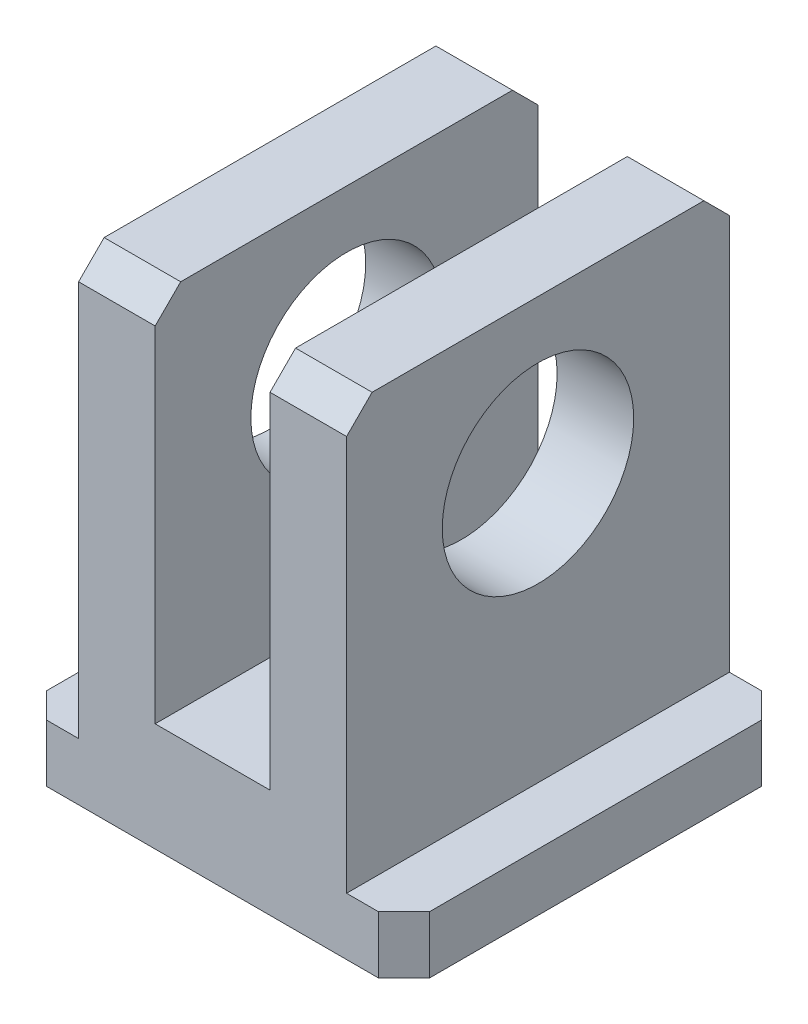
ISO-10303-21;
HEADER;
FILE_DESCRIPTION(('STEP AP214'),'2;1');
FILE_NAME('part.step','',(''),(''),'','','');
FILE_SCHEMA(('AUTOMOTIVE_DESIGN { 1 0 10303 214 1 1 1 1 }'));
ENDSEC;
DATA;
#1=APPLICATION_CONTEXT('core data for automotive mechanical design processes');
#2=APPLICATION_PROTOCOL_DEFINITION('international standard','automotive_design',2000,#1);
#3=PRODUCT_CONTEXT('',#1,'mechanical');
#4=PRODUCT('Part','Part','',(#3));
#5=PRODUCT_RELATED_PRODUCT_CATEGORY('part','',(#4));
#6=PRODUCT_DEFINITION_FORMATION('','',#4);
#7=PRODUCT_DEFINITION_CONTEXT('part definition',#1,'design');
#8=PRODUCT_DEFINITION('design','',#6,#7);
#9=PRODUCT_DEFINITION_SHAPE('','',#8);
#10=(LENGTH_UNIT() NAMED_UNIT(*) SI_UNIT(.MILLI.,.METRE.));
#11=(NAMED_UNIT(*) PLANE_ANGLE_UNIT() SI_UNIT($,.RADIAN.));
#12=(NAMED_UNIT(*) SI_UNIT($,.STERADIAN.) SOLID_ANGLE_UNIT());
#13=UNCERTAINTY_MEASURE_WITH_UNIT(LENGTH_MEASURE(1.E-05),#10,'distance_accuracy_value','');
#14=(GEOMETRIC_REPRESENTATION_CONTEXT(3) GLOBAL_UNCERTAINTY_ASSIGNED_CONTEXT((#13)) GLOBAL_UNIT_ASSIGNED_CONTEXT((#10,
#11,#12)) REPRESENTATION_CONTEXT('',''));
#15=CARTESIAN_POINT('',(0.,0.,0.));
#16=DIRECTION('',(0.,0.,1.));
#17=DIRECTION('',(1.,0.,0.));
#18=AXIS2_PLACEMENT_3D('',#15,#16,#17);
#19=CARTESIAN_POINT('',(0.,37.5,0.));
#20=DIRECTION('',(0.,-1.,0.));
#21=DIRECTION('',(0.,0.,-1.));
#22=AXIS2_PLACEMENT_3D('',#19,#20,#21);
#23=PLANE('',#22);
#24=DIRECTION('',(0.,0.,1.));
#25=VECTOR('',#24,1.);
#26=CARTESIAN_POINT('',(-4.5,37.5,0.));
#27=LINE('',#26,#25);
#28=CARTESIAN_POINT('',(-4.5,37.5,-13.));
#29=VERTEX_POINT('',#28);
#30=CARTESIAN_POINT('',(-4.5,37.5,13.));
#31=VERTEX_POINT('',#30);
#32=EDGE_CURVE('E289',#29,#31,#27,.T.);
#33=ORIENTED_EDGE('',*,*,#32,.F.);
#34=DIRECTION('',(1.,0.,0.));
#35=VECTOR('',#34,1.);
#36=CARTESIAN_POINT('',(-15.,37.5,-13.));
#37=LINE('',#36,#35);
#38=CARTESIAN_POINT('',(-10.5,37.5,-13.));
#39=VERTEX_POINT('',#38);
#40=EDGE_CURVE('E58',#39,#29,#37,.T.);
#41=ORIENTED_EDGE('',*,*,#40,.F.);
#42=DIRECTION('',(0.,0.,1.));
#43=VECTOR('',#42,1.);
#44=CARTESIAN_POINT('',(-10.5,37.5,-15.));
#45=LINE('',#44,#43);
#46=CARTESIAN_POINT('',(-10.5,37.5,13.));
#47=VERTEX_POINT('',#46);
#48=EDGE_CURVE('E214',#39,#47,#45,.T.);
#49=ORIENTED_EDGE('',*,*,#48,.T.);
#50=DIRECTION('',(1.,0.,0.));
#51=VECTOR('',#50,1.);
#52=CARTESIAN_POINT('',(-15.,37.5,13.));
#53=LINE('',#52,#51);
#54=EDGE_CURVE('E392',#47,#31,#53,.T.);
#55=ORIENTED_EDGE('',*,*,#54,.T.);
#56=EDGE_LOOP('',(#33,#41,#49,#55));
#57=FACE_BOUND('',#56,.T.);
#58=ADVANCED_FACE('F43',(#57),#23,.F.);
#59=CARTESIAN_POINT('',(-13.,37.5,15.));
#60=DIRECTION('',(0.,0.,-1.));
#61=DIRECTION('',(-1.,0.,0.));
#62=AXIS2_PLACEMENT_3D('',#59,#60,#61);
#63=PLANE('',#62);
#64=DIRECTION('',(0.,1.,0.));
#65=VECTOR('',#64,1.);
#66=CARTESIAN_POINT('',(10.5,4.5,15.));
#67=LINE('',#66,#65);
#68=CARTESIAN_POINT('',(10.5,4.5,15.));
#69=VERTEX_POINT('',#68);
#70=CARTESIAN_POINT('',(10.5,35.5,15.));
#71=VERTEX_POINT('',#70);
#72=EDGE_CURVE('E211',#69,#71,#67,.T.);
#73=ORIENTED_EDGE('',*,*,#72,.T.);
#74=DIRECTION('',(1.,0.,0.));
#75=VECTOR('',#74,1.);
#76=CARTESIAN_POINT('',(-15.,35.5,15.));
#77=LINE('',#76,#75);
#78=CARTESIAN_POINT('',(4.5,35.5,15.));
#79=VERTEX_POINT('',#78);
#80=EDGE_CURVE('E393',#79,#71,#77,.T.);
#81=ORIENTED_EDGE('',*,*,#80,.F.);
#82=DIRECTION('',(0.,1.,0.));
#83=VECTOR('',#82,1.);
#84=CARTESIAN_POINT('',(4.5,8.5,15.));
#85=LINE('',#84,#83);
#86=CARTESIAN_POINT('',(4.5,8.5,15.));
#87=VERTEX_POINT('',#86);
#88=EDGE_CURVE('E286',#87,#79,#85,.T.);
#89=ORIENTED_EDGE('',*,*,#88,.F.);
#90=DIRECTION('',(1.,0.,0.));
#91=VECTOR('',#90,1.);
#92=CARTESIAN_POINT('',(0.,8.5,15.));
#93=LINE('',#92,#91);
#94=CARTESIAN_POINT('',(-4.5,8.5,15.));
#95=VERTEX_POINT('',#94);
#96=EDGE_CURVE('E292',#95,#87,#93,.T.);
#97=ORIENTED_EDGE('',*,*,#96,.F.);
#98=DIRECTION('',(0.,1.,0.));
#99=VECTOR('',#98,1.);
#100=CARTESIAN_POINT('',(-4.5,8.5,15.));
#101=LINE('',#100,#99);
#102=CARTESIAN_POINT('',(-4.5,35.5,15.));
#103=VERTEX_POINT('',#102);
#104=EDGE_CURVE('E199',#95,#103,#101,.T.);
#105=ORIENTED_EDGE('',*,*,#104,.T.);
#106=CARTESIAN_POINT('',(-10.5,35.5,15.));
#107=VERTEX_POINT('',#106);
#108=EDGE_CURVE('E395',#107,#103,#77,.T.);
#109=ORIENTED_EDGE('',*,*,#108,.F.);
#110=DIRECTION('',(0.,1.,0.));
#111=VECTOR('',#110,1.);
#112=CARTESIAN_POINT('',(-10.5,4.5,15.));
#113=LINE('',#112,#111);
#114=CARTESIAN_POINT('',(-10.5,4.5,15.));
#115=VERTEX_POINT('',#114);
#116=EDGE_CURVE('E229',#115,#107,#113,.T.);
#117=ORIENTED_EDGE('',*,*,#116,.F.);
#118=DIRECTION('',(1.,0.,0.));
#119=VECTOR('',#118,1.);
#120=CARTESIAN_POINT('',(-13.,4.5,15.));
#121=LINE('',#120,#119);
#122=CARTESIAN_POINT('',(-13.,4.5,15.));
#123=VERTEX_POINT('',#122);
#124=EDGE_CURVE('E218',#123,#115,#121,.T.);
#125=ORIENTED_EDGE('',*,*,#124,.F.);
#126=DIRECTION('',(0.,-1.,0.));
#127=VECTOR('',#126,1.);
#128=CARTESIAN_POINT('',(-13.,37.5,15.));
#129=LINE('',#128,#127);
#130=CARTESIAN_POINT('',(-13.,0.,15.));
#131=VERTEX_POINT('',#130);
#132=EDGE_CURVE('E272',#123,#131,#129,.T.);
#133=ORIENTED_EDGE('',*,*,#132,.T.);
#134=DIRECTION('',(1.,0.,0.));
#135=VECTOR('',#134,1.);
#136=CARTESIAN_POINT('',(-13.,0.,15.));
#137=LINE('',#136,#135);
#138=CARTESIAN_POINT('',(13.,0.,15.));
#139=VERTEX_POINT('',#138);
#140=EDGE_CURVE('E242',#131,#139,#137,.T.);
#141=ORIENTED_EDGE('',*,*,#140,.T.);
#142=DIRECTION('',(0.,-1.,0.));
#143=VECTOR('',#142,1.);
#144=CARTESIAN_POINT('',(13.,37.5,15.));
#145=LINE('',#144,#143);
#146=CARTESIAN_POINT('',(13.,4.5,15.));
#147=VERTEX_POINT('',#146);
#148=EDGE_CURVE('E270',#147,#139,#145,.T.);
#149=ORIENTED_EDGE('',*,*,#148,.F.);
#150=DIRECTION('',(1.,0.,0.));
#151=VECTOR('',#150,1.);
#152=CARTESIAN_POINT('',(13.,4.5,15.));
#153=LINE('',#152,#151);
#154=EDGE_CURVE('E308',#69,#147,#153,.T.);
#155=ORIENTED_EDGE('',*,*,#154,.F.);
#156=EDGE_LOOP('',(#73,#81,#89,#97,#105,#109,#117,#125,#133,#141,#149,#155));
#157=FACE_BOUND('',#156,.T.);
#158=ADVANCED_FACE('F351',(#157),#63,.F.);
#159=CARTESIAN_POINT('',(-13.,37.5,-15.));
#160=DIRECTION('',(0.,0.,1.));
#161=DIRECTION('',(1.,0.,0.));
#162=AXIS2_PLACEMENT_3D('',#159,#160,#161);
#163=PLANE('',#162);
#164=DIRECTION('',(0.,1.,0.));
#165=VECTOR('',#164,1.);
#166=CARTESIAN_POINT('',(-10.5,4.5,-15.));
#167=LINE('',#166,#165);
#168=CARTESIAN_POINT('',(-10.5,4.5,-15.));
#169=VERTEX_POINT('',#168);
#170=CARTESIAN_POINT('',(-10.5,35.5,-15.));
#171=VERTEX_POINT('',#170);
#172=EDGE_CURVE('E231',#169,#171,#167,.T.);
#173=ORIENTED_EDGE('',*,*,#172,.T.);
#174=DIRECTION('',(1.,0.,0.));
#175=VECTOR('',#174,1.);
#176=CARTESIAN_POINT('',(-15.,35.5,-15.));
#177=LINE('',#176,#175);
#178=CARTESIAN_POINT('',(-4.5,35.5,-15.));
#179=VERTEX_POINT('',#178);
#180=EDGE_CURVE('E365',#171,#179,#177,.T.);
#181=ORIENTED_EDGE('',*,*,#180,.T.);
#182=DIRECTION('',(0.,1.,0.));
#183=VECTOR('',#182,1.);
#184=CARTESIAN_POINT('',(-4.5,8.5,-15.));
#185=LINE('',#184,#183);
#186=CARTESIAN_POINT('',(-4.5,8.5,-15.));
#187=VERTEX_POINT('',#186);
#188=EDGE_CURVE('E205',#187,#179,#185,.T.);
#189=ORIENTED_EDGE('',*,*,#188,.F.);
#190=DIRECTION('',(-1.,0.,0.));
#191=VECTOR('',#190,1.);
#192=CARTESIAN_POINT('',(0.,8.5,-15.));
#193=LINE('',#192,#191);
#194=CARTESIAN_POINT('',(4.5,8.5,-15.));
#195=VERTEX_POINT('',#194);
#196=EDGE_CURVE('E378',#195,#187,#193,.T.);
#197=ORIENTED_EDGE('',*,*,#196,.F.);
#198=DIRECTION('',(0.,1.,0.));
#199=VECTOR('',#198,1.);
#200=CARTESIAN_POINT('',(4.5,8.5,-15.));
#201=LINE('',#200,#199);
#202=CARTESIAN_POINT('',(4.5,35.5,-15.));
#203=VERTEX_POINT('',#202);
#204=EDGE_CURVE('E302',#195,#203,#201,.T.);
#205=ORIENTED_EDGE('',*,*,#204,.T.);
#206=CARTESIAN_POINT('',(10.5,35.5,-15.));
#207=VERTEX_POINT('',#206);
#208=EDGE_CURVE('E66',#203,#207,#177,.T.);
#209=ORIENTED_EDGE('',*,*,#208,.T.);
#210=DIRECTION('',(0.,1.,0.));
#211=VECTOR('',#210,1.);
#212=CARTESIAN_POINT('',(10.5,4.5,-15.));
#213=LINE('',#212,#211);
#214=CARTESIAN_POINT('',(10.5,4.5,-15.));
#215=VERTEX_POINT('',#214);
#216=EDGE_CURVE('E193',#215,#207,#213,.T.);
#217=ORIENTED_EDGE('',*,*,#216,.F.);
#218=DIRECTION('',(-1.,0.,0.));
#219=VECTOR('',#218,1.);
#220=CARTESIAN_POINT('',(10.5,4.5,-15.));
#221=LINE('',#220,#219);
#222=CARTESIAN_POINT('',(13.,4.5,-15.));
#223=VERTEX_POINT('',#222);
#224=EDGE_CURVE('E198',#223,#215,#221,.T.);
#225=ORIENTED_EDGE('',*,*,#224,.F.);
#226=DIRECTION('',(0.,-1.,0.));
#227=VECTOR('',#226,1.);
#228=CARTESIAN_POINT('',(13.,37.5,-15.));
#229=LINE('',#228,#227);
#230=CARTESIAN_POINT('',(13.,0.,-15.));
#231=VERTEX_POINT('',#230);
#232=EDGE_CURVE('E264',#223,#231,#229,.T.);
#233=ORIENTED_EDGE('',*,*,#232,.T.);
#234=DIRECTION('',(-1.,0.,0.));
#235=VECTOR('',#234,1.);
#236=CARTESIAN_POINT('',(-13.,0.,-15.));
#237=LINE('',#236,#235);
#238=CARTESIAN_POINT('',(-13.,0.,-15.));
#239=VERTEX_POINT('',#238);
#240=EDGE_CURVE('E254',#231,#239,#237,.T.);
#241=ORIENTED_EDGE('',*,*,#240,.T.);
#242=DIRECTION('',(0.,-1.,0.));
#243=VECTOR('',#242,1.);
#244=CARTESIAN_POINT('',(-13.,37.5,-15.));
#245=LINE('',#244,#243);
#246=CARTESIAN_POINT('',(-13.,4.5,-15.));
#247=VERTEX_POINT('',#246);
#248=EDGE_CURVE('E262',#247,#239,#245,.T.);
#249=ORIENTED_EDGE('',*,*,#248,.F.);
#250=DIRECTION('',(-1.,0.,0.));
#251=VECTOR('',#250,1.);
#252=CARTESIAN_POINT('',(-10.5,4.5,-15.));
#253=LINE('',#252,#251);
#254=EDGE_CURVE('E223',#169,#247,#253,.T.);
#255=ORIENTED_EDGE('',*,*,#254,.F.);
#256=EDGE_LOOP('',(#173,#181,#189,#197,#205,#209,#217,#225,#233,#241,#249,#255));
#257=FACE_BOUND('',#256,.T.);
#258=ADVANCED_FACE('F321',(#257),#163,.F.);
#259=DIRECTION('',(0.,0.,1.));
#260=VECTOR('',#259,1.);
#261=CARTESIAN_POINT('',(10.5,37.5,-15.));
#262=LINE('',#261,#260);
#263=CARTESIAN_POINT('',(10.5,37.5,-13.));
#264=VERTEX_POINT('',#263);
#265=CARTESIAN_POINT('',(10.5,37.5,13.));
#266=VERTEX_POINT('',#265);
#267=EDGE_CURVE('E190',#264,#266,#262,.T.);
#268=ORIENTED_EDGE('',*,*,#267,.F.);
#269=CARTESIAN_POINT('',(4.49999999999999,37.5,-13.));
#270=VERTEX_POINT('',#269);
#271=EDGE_CURVE('E177',#270,#264,#37,.T.);
#272=ORIENTED_EDGE('',*,*,#271,.F.);
#273=DIRECTION('',(0.,0.,-1.));
#274=VECTOR('',#273,1.);
#275=CARTESIAN_POINT('',(4.5,37.5,0.));
#276=LINE('',#275,#274);
#277=CARTESIAN_POINT('',(4.5,37.5,13.));
#278=VERTEX_POINT('',#277);
#279=EDGE_CURVE('E284',#278,#270,#276,.T.);
#280=ORIENTED_EDGE('',*,*,#279,.F.);
#281=EDGE_CURVE('E197',#278,#266,#53,.T.);
#282=ORIENTED_EDGE('',*,*,#281,.T.);
#283=EDGE_LOOP('',(#268,#272,#280,#282));
#284=FACE_BOUND('',#283,.T.);
#285=ADVANCED_FACE('F196',(#284),#23,.F.);
#286=CARTESIAN_POINT('',(-15.,37.5,13.));
#287=DIRECTION('',(1.,0.,0.));
#288=DIRECTION('',(0.,0.,-1.));
#289=AXIS2_PLACEMENT_3D('',#286,#287,#288);
#290=PLANE('',#289);
#291=DIRECTION('',(0.,-1.,0.));
#292=VECTOR('',#291,1.);
#293=CARTESIAN_POINT('',(-15.,37.5,13.));
#294=LINE('',#293,#292);
#295=CARTESIAN_POINT('',(-15.,4.5,13.));
#296=VERTEX_POINT('',#295);
#297=CARTESIAN_POINT('',(-15.,0.,13.));
#298=VERTEX_POINT('',#297);
#299=EDGE_CURVE('E274',#296,#298,#294,.T.);
#300=ORIENTED_EDGE('',*,*,#299,.F.);
#301=DIRECTION('',(0.,0.,1.));
#302=VECTOR('',#301,1.);
#303=CARTESIAN_POINT('',(-15.,4.5,-13.));
#304=LINE('',#303,#302);
#305=CARTESIAN_POINT('',(-15.,4.5,-13.));
#306=VERTEX_POINT('',#305);
#307=EDGE_CURVE('E227',#306,#296,#304,.T.);
#308=ORIENTED_EDGE('',*,*,#307,.F.);
#309=DIRECTION('',(0.,-1.,0.));
#310=VECTOR('',#309,1.);
#311=CARTESIAN_POINT('',(-15.,37.5,-13.));
#312=LINE('',#311,#310);
#313=CARTESIAN_POINT('',(-15.,0.,-13.));
#314=VERTEX_POINT('',#313);
#315=EDGE_CURVE('E260',#306,#314,#312,.T.);
#316=ORIENTED_EDGE('',*,*,#315,.T.);
#317=DIRECTION('',(0.,0.,1.));
#318=VECTOR('',#317,1.);
#319=CARTESIAN_POINT('',(-15.,0.,13.));
#320=LINE('',#319,#318);
#321=EDGE_CURVE('E234',#314,#298,#320,.T.);
#322=ORIENTED_EDGE('',*,*,#321,.T.);
#323=EDGE_LOOP('',(#300,#308,#316,#322));
#324=FACE_BOUND('',#323,.T.);
#325=ADVANCED_FACE('F45',(#324),#290,.F.);
#326=CARTESIAN_POINT('',(-15.,37.5,13.));
#327=DIRECTION('',(0.707106781186548,0.,-0.707106781186548));
#328=DIRECTION('',(-0.707106781186548,0.,-0.707106781186548));
#329=AXIS2_PLACEMENT_3D('',#326,#327,#328);
#330=PLANE('',#329);
#331=ORIENTED_EDGE('',*,*,#132,.F.);
#332=DIRECTION('',(0.707106781186548,0.,0.707106781186548));
#333=VECTOR('',#332,1.);
#334=CARTESIAN_POINT('',(-15.,4.5,13.));
#335=LINE('',#334,#333);
#336=EDGE_CURVE('E216',#296,#123,#335,.T.);
#337=ORIENTED_EDGE('',*,*,#336,.F.);
#338=ORIENTED_EDGE('',*,*,#299,.T.);
#339=DIRECTION('',(0.707106781186548,0.,0.707106781186548));
#340=VECTOR('',#339,1.);
#341=CARTESIAN_POINT('',(-15.,0.,13.));
#342=LINE('',#341,#340);
#343=EDGE_CURVE('E239',#298,#131,#342,.T.);
#344=ORIENTED_EDGE('',*,*,#343,.T.);
#345=EDGE_LOOP('',(#331,#337,#338,#344));
#346=FACE_BOUND('',#345,.T.);
#347=ADVANCED_FACE('F346',(#346),#330,.F.);
#348=CARTESIAN_POINT('',(13.,37.5,15.));
#349=DIRECTION('',(-0.707106781186548,0.,-0.707106781186548));
#350=DIRECTION('',(-0.707106781186548,0.,0.707106781186548));
#351=AXIS2_PLACEMENT_3D('',#348,#349,#350);
#352=PLANE('',#351);
#353=DIRECTION('',(0.,-1.,0.));
#354=VECTOR('',#353,1.);
#355=CARTESIAN_POINT('',(15.,37.5,13.));
#356=LINE('',#355,#354);
#357=CARTESIAN_POINT('',(15.,4.5,13.));
#358=VERTEX_POINT('',#357);
#359=CARTESIAN_POINT('',(15.,0.,13.));
#360=VERTEX_POINT('',#359);
#361=EDGE_CURVE('E268',#358,#360,#356,.T.);
#362=ORIENTED_EDGE('',*,*,#361,.F.);
#363=DIRECTION('',(0.707106781186548,0.,-0.707106781186548));
#364=VECTOR('',#363,1.);
#365=CARTESIAN_POINT('',(15.,4.5,13.));
#366=LINE('',#365,#364);
#367=EDGE_CURVE('E310',#147,#358,#366,.T.);
#368=ORIENTED_EDGE('',*,*,#367,.F.);
#369=ORIENTED_EDGE('',*,*,#148,.T.);
#370=DIRECTION('',(0.707106781186548,0.,-0.707106781186548));
#371=VECTOR('',#370,1.);
#372=CARTESIAN_POINT('',(13.,0.,15.));
#373=LINE('',#372,#371);
#374=EDGE_CURVE('E245',#139,#360,#373,.T.);
#375=ORIENTED_EDGE('',*,*,#374,.T.);
#376=EDGE_LOOP('',(#362,#368,#369,#375));
#377=FACE_BOUND('',#376,.T.);
#378=ADVANCED_FACE('F405',(#377),#352,.F.);
#379=CARTESIAN_POINT('',(15.,37.5,13.));
#380=DIRECTION('',(-1.,0.,0.));
#381=DIRECTION('',(0.,0.,1.));
#382=AXIS2_PLACEMENT_3D('',#379,#380,#381);
#383=PLANE('',#382);
#384=DIRECTION('',(0.,-1.,0.));
#385=VECTOR('',#384,1.);
#386=CARTESIAN_POINT('',(15.,37.5,-13.));
#387=LINE('',#386,#385);
#388=CARTESIAN_POINT('',(15.,4.5,-13.));
#389=VERTEX_POINT('',#388);
#390=CARTESIAN_POINT('',(15.,0.,-13.));
#391=VERTEX_POINT('',#390);
#392=EDGE_CURVE('E266',#389,#391,#387,.T.);
#393=ORIENTED_EDGE('',*,*,#392,.F.);
#394=DIRECTION('',(0.,0.,-1.));
#395=VECTOR('',#394,1.);
#396=CARTESIAN_POINT('',(15.,4.5,-13.));
#397=LINE('',#396,#395);
#398=EDGE_CURVE('E311',#358,#389,#397,.T.);
#399=ORIENTED_EDGE('',*,*,#398,.F.);
#400=ORIENTED_EDGE('',*,*,#361,.T.);
#401=DIRECTION('',(0.,0.,-1.));
#402=VECTOR('',#401,1.);
#403=CARTESIAN_POINT('',(15.,0.,13.));
#404=LINE('',#403,#402);
#405=EDGE_CURVE('E248',#360,#391,#404,.T.);
#406=ORIENTED_EDGE('',*,*,#405,.T.);
#407=EDGE_LOOP('',(#393,#399,#400,#406));
#408=FACE_BOUND('',#407,.T.);
#409=ADVANCED_FACE('F407',(#408),#383,.F.);
#410=CARTESIAN_POINT('',(13.,37.5,-15.));
#411=DIRECTION('',(-0.707106781186548,0.,0.707106781186548));
#412=DIRECTION('',(0.707106781186548,0.,0.707106781186548));
#413=AXIS2_PLACEMENT_3D('',#410,#411,#412);
#414=PLANE('',#413);
#415=ORIENTED_EDGE('',*,*,#232,.F.);
#416=DIRECTION('',(-0.707106781186548,0.,-0.707106781186548));
#417=VECTOR('',#416,1.);
#418=CARTESIAN_POINT('',(13.,4.5,-15.));
#419=LINE('',#418,#417);
#420=EDGE_CURVE('E209',#389,#223,#419,.T.);
#421=ORIENTED_EDGE('',*,*,#420,.F.);
#422=ORIENTED_EDGE('',*,*,#392,.T.);
#423=DIRECTION('',(-0.707106781186548,0.,-0.707106781186548));
#424=VECTOR('',#423,1.);
#425=CARTESIAN_POINT('',(13.,0.,-15.));
#426=LINE('',#425,#424);
#427=EDGE_CURVE('E251',#391,#231,#426,.T.);
#428=ORIENTED_EDGE('',*,*,#427,.T.);
#429=EDGE_LOOP('',(#415,#421,#422,#428));
#430=FACE_BOUND('',#429,.T.);
#431=ADVANCED_FACE('F322',(#430),#414,.F.);
#432=CARTESIAN_POINT('',(-15.,37.5,-13.));
#433=DIRECTION('',(0.707106781186548,0.,0.707106781186548));
#434=DIRECTION('',(0.707106781186548,0.,-0.707106781186548));
#435=AXIS2_PLACEMENT_3D('',#432,#433,#434);
#436=PLANE('',#435);
#437=ORIENTED_EDGE('',*,*,#315,.F.);
#438=DIRECTION('',(-0.707106781186548,0.,0.707106781186548));
#439=VECTOR('',#438,1.);
#440=CARTESIAN_POINT('',(-13.,4.5,-15.));
#441=LINE('',#440,#439);
#442=EDGE_CURVE('E225',#247,#306,#441,.T.);
#443=ORIENTED_EDGE('',*,*,#442,.F.);
#444=ORIENTED_EDGE('',*,*,#248,.T.);
#445=DIRECTION('',(-0.707106781186548,0.,0.707106781186548));
#446=VECTOR('',#445,1.);
#447=CARTESIAN_POINT('',(-15.,0.,-13.));
#448=LINE('',#447,#446);
#449=EDGE_CURVE('E257',#239,#314,#448,.T.);
#450=ORIENTED_EDGE('',*,*,#449,.T.);
#451=EDGE_LOOP('',(#437,#443,#444,#450));
#452=FACE_BOUND('',#451,.T.);
#453=ADVANCED_FACE('F335',(#452),#436,.F.);
#454=CARTESIAN_POINT('',(0.,0.,0.));
#455=DIRECTION('',(0.,-1.,0.));
#456=DIRECTION('',(0.,0.,-1.));
#457=AXIS2_PLACEMENT_3D('',#454,#455,#456);
#458=PLANE('',#457);
#459=ORIENTED_EDGE('',*,*,#321,.F.);
#460=ORIENTED_EDGE('',*,*,#449,.F.);
#461=ORIENTED_EDGE('',*,*,#240,.F.);
#462=ORIENTED_EDGE('',*,*,#427,.F.);
#463=ORIENTED_EDGE('',*,*,#405,.F.);
#464=ORIENTED_EDGE('',*,*,#374,.F.);
#465=ORIENTED_EDGE('',*,*,#140,.F.);
#466=ORIENTED_EDGE('',*,*,#343,.F.);
#467=EDGE_LOOP('',(#459,#460,#461,#462,#463,#464,#465,#466));
#468=FACE_BOUND('',#467,.T.);
#469=ADVANCED_FACE('F329',(#468),#458,.T.);
#470=CARTESIAN_POINT('',(-10.5,4.5,-15.));
#471=DIRECTION('',(-1.,0.,0.));
#472=DIRECTION('',(0.,0.,1.));
#473=AXIS2_PLACEMENT_3D('',#470,#471,#472);
#474=PLANE('',#473);
#475=DIRECTION('',(0.,0.707106781186548,0.707106781186547));
#476=VECTOR('',#475,1.);
#477=CARTESIAN_POINT('',(-10.5,20.,-30.5));
#478=LINE('',#477,#476);
#479=EDGE_CURVE('E362',#171,#39,#478,.T.);
#480=ORIENTED_EDGE('',*,*,#479,.F.);
#481=ORIENTED_EDGE('',*,*,#172,.F.);
#482=DIRECTION('',(0.,0.,1.));
#483=VECTOR('',#482,1.);
#484=CARTESIAN_POINT('',(-10.5,4.5,-15.));
#485=LINE('',#484,#483);
#486=EDGE_CURVE('E221',#169,#115,#485,.T.);
#487=ORIENTED_EDGE('',*,*,#486,.T.);
#488=ORIENTED_EDGE('',*,*,#116,.T.);
#489=DIRECTION('',(0.,-0.707106781186548,0.707106781186547));
#490=VECTOR('',#489,1.);
#491=CARTESIAN_POINT('',(-10.5,35.,15.5));
#492=LINE('',#491,#490);
#493=EDGE_CURVE('E388',#47,#107,#492,.T.);
#494=ORIENTED_EDGE('',*,*,#493,.F.);
#495=ORIENTED_EDGE('',*,*,#48,.F.);
#496=EDGE_LOOP('',(#480,#481,#487,#488,#494,#495));
#497=FACE_BOUND('',#496,.T.);
#498=CARTESIAN_POINT('',(-10.5,25.5,0.));
#499=DIRECTION('',(-1.,0.,0.));
#500=DIRECTION('',(0.,0.,1.));
#501=AXIS2_PLACEMENT_3D('',#498,#499,#500);
#502=CIRCLE('',#501,7.5);
#503=CARTESIAN_POINT('',(-10.5,25.5,-7.5));
#504=VERTEX_POINT('',#503);
#505=EDGE_CURVE('E290',#504,#504,#502,.T.);
#506=ORIENTED_EDGE('',*,*,#505,.F.);
#507=EDGE_LOOP('',(#506));
#508=FACE_BOUND('',#507,.T.);
#509=ADVANCED_FACE('F358',(#497,#508),#474,.T.);
#510=CARTESIAN_POINT('',(0.,4.5,0.));
#511=DIRECTION('',(0.,-1.,0.));
#512=DIRECTION('',(0.,0.,-1.));
#513=AXIS2_PLACEMENT_3D('',#510,#511,#512);
#514=PLANE('',#513);
#515=ORIENTED_EDGE('',*,*,#336,.T.);
#516=ORIENTED_EDGE('',*,*,#124,.T.);
#517=ORIENTED_EDGE('',*,*,#486,.F.);
#518=ORIENTED_EDGE('',*,*,#254,.T.);
#519=ORIENTED_EDGE('',*,*,#442,.T.);
#520=ORIENTED_EDGE('',*,*,#307,.T.);
#521=EDGE_LOOP('',(#515,#516,#517,#518,#519,#520));
#522=FACE_BOUND('',#521,.T.);
#523=ADVANCED_FACE('F338',(#522),#514,.F.);
#524=CARTESIAN_POINT('',(10.5,4.5,-15.));
#525=DIRECTION('',(-1.,0.,0.));
#526=DIRECTION('',(0.,0.,1.));
#527=AXIS2_PLACEMENT_3D('',#524,#525,#526);
#528=PLANE('',#527);
#529=CARTESIAN_POINT('',(10.5,25.5,0.));
#530=DIRECTION('',(1.,0.,0.));
#531=DIRECTION('',(0.,0.,-1.));
#532=AXIS2_PLACEMENT_3D('',#529,#530,#531);
#533=CIRCLE('',#532,7.5);
#534=CARTESIAN_POINT('',(10.5,25.5,-7.5));
#535=VERTEX_POINT('',#534);
#536=EDGE_CURVE('E279',#535,#535,#533,.T.);
#537=ORIENTED_EDGE('',*,*,#536,.F.);
#538=EDGE_LOOP('',(#537));
#539=FACE_BOUND('',#538,.T.);
#540=ORIENTED_EDGE('',*,*,#216,.T.);
#541=DIRECTION('',(0.,-0.707106781186548,-0.707106781186547));
#542=VECTOR('',#541,1.);
#543=CARTESIAN_POINT('',(10.5,37.5,-13.));
#544=LINE('',#543,#542);
#545=EDGE_CURVE('E180',#264,#207,#544,.T.);
#546=ORIENTED_EDGE('',*,*,#545,.F.);
#547=ORIENTED_EDGE('',*,*,#267,.T.);
#548=DIRECTION('',(0.,0.707106781186548,-0.707106781186547));
#549=VECTOR('',#548,1.);
#550=CARTESIAN_POINT('',(10.5,37.5,13.));
#551=LINE('',#550,#549);
#552=EDGE_CURVE('E396',#71,#266,#551,.T.);
#553=ORIENTED_EDGE('',*,*,#552,.F.);
#554=ORIENTED_EDGE('',*,*,#72,.F.);
#555=DIRECTION('',(0.,0.,1.));
#556=VECTOR('',#555,1.);
#557=CARTESIAN_POINT('',(10.5,4.5,-15.));
#558=LINE('',#557,#556);
#559=EDGE_CURVE('E202',#215,#69,#558,.T.);
#560=ORIENTED_EDGE('',*,*,#559,.F.);
#561=EDGE_LOOP('',(#540,#546,#547,#553,#554,#560));
#562=FACE_BOUND('',#561,.T.);
#563=ADVANCED_FACE('F188',(#539,#562),#528,.F.);
#564=CARTESIAN_POINT('',(0.,4.5,0.));
#565=DIRECTION('',(0.,-1.,0.));
#566=DIRECTION('',(0.,0.,-1.));
#567=AXIS2_PLACEMENT_3D('',#564,#565,#566);
#568=PLANE('',#567);
#569=ORIENTED_EDGE('',*,*,#224,.T.);
#570=ORIENTED_EDGE('',*,*,#559,.T.);
#571=ORIENTED_EDGE('',*,*,#154,.T.);
#572=ORIENTED_EDGE('',*,*,#367,.T.);
#573=ORIENTED_EDGE('',*,*,#398,.T.);
#574=ORIENTED_EDGE('',*,*,#420,.T.);
#575=EDGE_LOOP('',(#569,#570,#571,#572,#573,#574));
#576=FACE_BOUND('',#575,.T.);
#577=ADVANCED_FACE('F316',(#576),#568,.F.);
#578=CARTESIAN_POINT('',(-4.5,8.5,0.));
#579=DIRECTION('',(-1.,0.,0.));
#580=DIRECTION('',(0.,0.,1.));
#581=AXIS2_PLACEMENT_3D('',#578,#579,#580);
#582=PLANE('',#581);
#583=CARTESIAN_POINT('',(-4.5,25.5,0.));
#584=DIRECTION('',(-1.,0.,0.));
#585=DIRECTION('',(0.,0.,1.));
#586=AXIS2_PLACEMENT_3D('',#583,#584,#585);
#587=CIRCLE('',#586,7.5);
#588=CARTESIAN_POINT('',(-4.5,25.5,-7.5));
#589=VERTEX_POINT('',#588);
#590=EDGE_CURVE('E278',#589,#589,#587,.T.);
#591=ORIENTED_EDGE('',*,*,#590,.T.);
#592=EDGE_LOOP('',(#591));
#593=FACE_BOUND('',#592,.T.);
#594=ORIENTED_EDGE('',*,*,#188,.T.);
#595=DIRECTION('',(0.,0.707106781186548,0.707106781186547));
#596=VECTOR('',#595,1.);
#597=CARTESIAN_POINT('',(-4.5,29.5,-21.));
#598=LINE('',#597,#596);
#599=EDGE_CURVE('E367',#179,#29,#598,.T.);
#600=ORIENTED_EDGE('',*,*,#599,.T.);
#601=ORIENTED_EDGE('',*,*,#32,.T.);
#602=DIRECTION('',(0.,-0.707106781186548,0.707106781186547));
#603=VECTOR('',#602,1.);
#604=CARTESIAN_POINT('',(-4.5,29.5,21.));
#605=LINE('',#604,#603);
#606=EDGE_CURVE('E390',#31,#103,#605,.T.);
#607=ORIENTED_EDGE('',*,*,#606,.T.);
#608=ORIENTED_EDGE('',*,*,#104,.F.);
#609=DIRECTION('',(0.,0.,1.));
#610=VECTOR('',#609,1.);
#611=CARTESIAN_POINT('',(-4.5,8.5,0.));
#612=LINE('',#611,#610);
#613=EDGE_CURVE('E297',#187,#95,#612,.T.);
#614=ORIENTED_EDGE('',*,*,#613,.F.);
#615=EDGE_LOOP('',(#594,#600,#601,#607,#608,#614));
#616=FACE_BOUND('',#615,.T.);
#617=ADVANCED_FACE('F371',(#593,#616),#582,.F.);
#618=CARTESIAN_POINT('',(4.5,8.5,0.));
#619=DIRECTION('',(1.,0.,0.));
#620=DIRECTION('',(0.,0.,-1.));
#621=AXIS2_PLACEMENT_3D('',#618,#619,#620);
#622=PLANE('',#621);
#623=CARTESIAN_POINT('',(4.5,25.5,0.));
#624=DIRECTION('',(1.,0.,0.));
#625=DIRECTION('',(0.,0.,-1.));
#626=AXIS2_PLACEMENT_3D('',#623,#624,#625);
#627=CIRCLE('',#626,7.5);
#628=CARTESIAN_POINT('',(4.49999999999999,25.5,-7.5));
#629=VERTEX_POINT('',#628);
#630=EDGE_CURVE('E276',#629,#629,#627,.T.);
#631=ORIENTED_EDGE('',*,*,#630,.T.);
#632=EDGE_LOOP('',(#631));
#633=FACE_BOUND('',#632,.T.);
#634=ORIENTED_EDGE('',*,*,#279,.T.);
#635=DIRECTION('',(0.,-0.707106781186548,-0.707106781186547));
#636=VECTOR('',#635,1.);
#637=CARTESIAN_POINT('',(4.5,29.5,-21.));
#638=LINE('',#637,#636);
#639=EDGE_CURVE('E11',#270,#203,#638,.T.);
#640=ORIENTED_EDGE('',*,*,#639,.T.);
#641=ORIENTED_EDGE('',*,*,#204,.F.);
#642=DIRECTION('',(0.,0.,-1.));
#643=VECTOR('',#642,1.);
#644=CARTESIAN_POINT('',(4.5,8.5,0.));
#645=LINE('',#644,#643);
#646=EDGE_CURVE('E379',#87,#195,#645,.T.);
#647=ORIENTED_EDGE('',*,*,#646,.F.);
#648=ORIENTED_EDGE('',*,*,#88,.T.);
#649=DIRECTION('',(0.,0.707106781186548,-0.707106781186547));
#650=VECTOR('',#649,1.);
#651=CARTESIAN_POINT('',(4.5,29.5,21.));
#652=LINE('',#651,#650);
#653=EDGE_CURVE('E51',#79,#278,#652,.T.);
#654=ORIENTED_EDGE('',*,*,#653,.T.);
#655=EDGE_LOOP('',(#634,#640,#641,#647,#648,#654));
#656=FACE_BOUND('',#655,.T.);
#657=ADVANCED_FACE('F283',(#633,#656),#622,.F.);
#658=CARTESIAN_POINT('',(0.,8.5,0.));
#659=DIRECTION('',(0.,1.,0.));
#660=DIRECTION('',(0.,0.,1.));
#661=AXIS2_PLACEMENT_3D('',#658,#659,#660);
#662=PLANE('',#661);
#663=ORIENTED_EDGE('',*,*,#96,.T.);
#664=ORIENTED_EDGE('',*,*,#646,.T.);
#665=ORIENTED_EDGE('',*,*,#196,.T.);
#666=ORIENTED_EDGE('',*,*,#613,.T.);
#667=EDGE_LOOP('',(#663,#664,#665,#666));
#668=FACE_BOUND('',#667,.T.);
#669=ADVANCED_FACE('F400',(#668),#662,.T.);
#670=CARTESIAN_POINT('',(-15.,25.5,0.));
#671=DIRECTION('',(1.,0.,0.));
#672=DIRECTION('',(0.,0.,-1.));
#673=AXIS2_PLACEMENT_3D('',#670,#671,#672);
#674=CYLINDRICAL_SURFACE('',#673,7.5);
#675=CARTESIAN_POINT('',(10.5,25.5,-7.5));
#676=CARTESIAN_POINT('',(10.4375,25.5,-7.5));
#677=CARTESIAN_POINT('',(10.375,25.5,-7.5));
#678=CARTESIAN_POINT('',(10.25,25.5,-7.5));
#679=CARTESIAN_POINT('',(10.1875,25.5,-7.5));
#680=CARTESIAN_POINT('',(10.0625,25.5,-7.5));
#681=CARTESIAN_POINT('',(10.,25.5,-7.5));
#682=CARTESIAN_POINT('',(9.875,25.5,-7.5));
#683=CARTESIAN_POINT('',(9.8125,25.5,-7.5));
#684=CARTESIAN_POINT('',(9.6875,25.5,-7.5));
#685=CARTESIAN_POINT('',(9.625,25.5,-7.5));
#686=CARTESIAN_POINT('',(9.5,25.5,-7.5));
#687=CARTESIAN_POINT('',(9.4375,25.5,-7.5));
#688=CARTESIAN_POINT('',(9.3125,25.5,-7.5));
#689=CARTESIAN_POINT('',(9.25,25.5,-7.5));
#690=CARTESIAN_POINT('',(9.125,25.5,-7.5));
#691=CARTESIAN_POINT('',(9.0625,25.5,-7.5));
#692=CARTESIAN_POINT('',(8.9375,25.5,-7.5));
#693=CARTESIAN_POINT('',(8.875,25.5,-7.5));
#694=CARTESIAN_POINT('',(8.75,25.5,-7.5));
#695=CARTESIAN_POINT('',(8.6875,25.5,-7.5));
#696=CARTESIAN_POINT('',(8.5625,25.5,-7.5));
#697=CARTESIAN_POINT('',(8.5,25.5,-7.5));
#698=CARTESIAN_POINT('',(8.375,25.5,-7.5));
#699=CARTESIAN_POINT('',(8.3125,25.5,-7.5));
#700=CARTESIAN_POINT('',(8.1875,25.5,-7.5));
#701=CARTESIAN_POINT('',(8.125,25.5,-7.5));
#702=CARTESIAN_POINT('',(8.,25.5,-7.5));
#703=CARTESIAN_POINT('',(7.9375,25.5,-7.5));
#704=CARTESIAN_POINT('',(7.8125,25.5,-7.5));
#705=CARTESIAN_POINT('',(7.75,25.5,-7.5));
#706=CARTESIAN_POINT('',(7.625,25.5,-7.5));
#707=CARTESIAN_POINT('',(7.5625,25.5,-7.5));
#708=CARTESIAN_POINT('',(7.4375,25.5,-7.5));
#709=CARTESIAN_POINT('',(7.375,25.5,-7.5));
#710=CARTESIAN_POINT('',(7.25,25.5,-7.5));
#711=CARTESIAN_POINT('',(7.1875,25.5,-7.5));
#712=CARTESIAN_POINT('',(7.0625,25.5,-7.5));
#713=CARTESIAN_POINT('',(7.,25.5,-7.5));
#714=CARTESIAN_POINT('',(6.875,25.5,-7.5));
#715=CARTESIAN_POINT('',(6.8125,25.5,-7.5));
#716=CARTESIAN_POINT('',(6.6875,25.5,-7.5));
#717=CARTESIAN_POINT('',(6.625,25.5,-7.5));
#718=CARTESIAN_POINT('',(6.5,25.5,-7.5));
#719=CARTESIAN_POINT('',(6.4375,25.5,-7.5));
#720=CARTESIAN_POINT('',(6.3125,25.5,-7.5));
#721=CARTESIAN_POINT('',(6.25,25.5,-7.5));
#722=CARTESIAN_POINT('',(6.12499999999999,25.5,-7.5));
#723=CARTESIAN_POINT('',(6.06249999999999,25.5,-7.5));
#724=CARTESIAN_POINT('',(5.93749999999999,25.5,-7.5));
#725=CARTESIAN_POINT('',(5.87499999999999,25.5,-7.5));
#726=CARTESIAN_POINT('',(5.74999999999999,25.5,-7.5));
#727=CARTESIAN_POINT('',(5.68749999999999,25.5,-7.5));
#728=CARTESIAN_POINT('',(5.56249999999999,25.5,-7.5));
#729=CARTESIAN_POINT('',(5.49999999999999,25.5,-7.5));
#730=CARTESIAN_POINT('',(5.37499999999999,25.5,-7.5));
#731=CARTESIAN_POINT('',(5.31249999999999,25.5,-7.5));
#732=CARTESIAN_POINT('',(5.18749999999999,25.5,-7.5));
#733=CARTESIAN_POINT('',(5.12499999999999,25.5,-7.5));
#734=CARTESIAN_POINT('',(4.99999999999999,25.5,-7.5));
#735=CARTESIAN_POINT('',(4.93749999999999,25.5,-7.5));
#736=CARTESIAN_POINT('',(4.81249999999999,25.5,-7.5));
#737=CARTESIAN_POINT('',(4.74999999999999,25.5,-7.5));
#738=CARTESIAN_POINT('',(4.62499999999999,25.5,-7.5));
#739=CARTESIAN_POINT('',(4.56249999999999,25.5,-7.5));
#740=CARTESIAN_POINT('',(4.49999999999999,25.5,-7.5));
#741=B_SPLINE_CURVE_WITH_KNOTS('',3,(#675,#676,#677,#678,#679,#680,#681,#682,#683,#684,#685,
#686,#687,#688,#689,#690,#691,#692,#693,#694,#695,#696,#697,#698,#699,#700,#701,#702,#703,#704,
#705,#706,#707,#708,#709,#710,#711,#712,#713,#714,#715,#716,#717,#718,#719,#720,#721,#722,#723,
#724,#725,#726,#727,#728,#729,#730,#731,#732,#733,#734,#735,#736,#737,#738,#739,#740),
.UNSPECIFIED.,.F.,.F.,(4,2,2,2,2,2,2,2,2,2,2,2,2,2,2,2,2,2,2,2,2,2,2,2,2,2,2,2,2,2,2,2,4),(0.,
0.1875,0.375,0.5625,0.750000000000001,0.937500000000001,1.125,1.3125,1.5,1.6875,1.875,2.0625,
2.25,2.4375,2.625,2.8125,3.,3.1875,3.375,3.5625,3.75,3.9375,4.125,4.3125,4.5,4.6875,4.875,
5.0625,5.25,5.4375,5.62500000000001,5.81250000000001,6.00000000000001),.UNSPECIFIED.);
#742=EDGE_CURVE('BSEAM458',#535,#629,#741,.T.);
#743=ORIENTED_EDGE('',*,*,#536,.T.);
#744=ORIENTED_EDGE('',*,*,#630,.F.);
#745=ORIENTED_EDGE('',*,*,#742,.T.);
#746=ORIENTED_EDGE('',*,*,#742,.F.);
#747=EDGE_LOOP('',(#743,#745,#744,#746));
#748=FACE_BOUND('',#747,.T.);
#749=ADVANCED_FACE('F458',(#748),#674,.F.);
#750=CARTESIAN_POINT('',(-10.5,25.5,-7.5));
#751=CARTESIAN_POINT('',(-10.4375,25.5,-7.5));
#752=CARTESIAN_POINT('',(-10.375,25.5,-7.5));
#753=CARTESIAN_POINT('',(-10.25,25.5,-7.5));
#754=CARTESIAN_POINT('',(-10.1875,25.5,-7.5));
#755=CARTESIAN_POINT('',(-10.0625,25.5,-7.5));
#756=CARTESIAN_POINT('',(-10.,25.5,-7.5));
#757=CARTESIAN_POINT('',(-9.875,25.5,-7.5));
#758=CARTESIAN_POINT('',(-9.8125,25.5,-7.5));
#759=CARTESIAN_POINT('',(-9.6875,25.5,-7.5));
#760=CARTESIAN_POINT('',(-9.625,25.5,-7.5));
#761=CARTESIAN_POINT('',(-9.5,25.5,-7.5));
#762=CARTESIAN_POINT('',(-9.4375,25.5,-7.5));
#763=CARTESIAN_POINT('',(-9.3125,25.5,-7.5));
#764=CARTESIAN_POINT('',(-9.25,25.5,-7.5));
#765=CARTESIAN_POINT('',(-9.125,25.5,-7.5));
#766=CARTESIAN_POINT('',(-9.0625,25.5,-7.5));
#767=CARTESIAN_POINT('',(-8.9375,25.5,-7.5));
#768=CARTESIAN_POINT('',(-8.875,25.5,-7.5));
#769=CARTESIAN_POINT('',(-8.75,25.5,-7.5));
#770=CARTESIAN_POINT('',(-8.6875,25.5,-7.5));
#771=CARTESIAN_POINT('',(-8.5625,25.5,-7.5));
#772=CARTESIAN_POINT('',(-8.5,25.5,-7.5));
#773=CARTESIAN_POINT('',(-8.375,25.5,-7.5));
#774=CARTESIAN_POINT('',(-8.3125,25.5,-7.5));
#775=CARTESIAN_POINT('',(-8.1875,25.5,-7.5));
#776=CARTESIAN_POINT('',(-8.125,25.5,-7.5));
#777=CARTESIAN_POINT('',(-8.,25.5,-7.5));
#778=CARTESIAN_POINT('',(-7.9375,25.5,-7.5));
#779=CARTESIAN_POINT('',(-7.8125,25.5,-7.5));
#780=CARTESIAN_POINT('',(-7.75,25.5,-7.5));
#781=CARTESIAN_POINT('',(-7.625,25.5,-7.5));
#782=CARTESIAN_POINT('',(-7.5625,25.5,-7.5));
#783=CARTESIAN_POINT('',(-7.4375,25.5,-7.5));
#784=CARTESIAN_POINT('',(-7.375,25.5,-7.5));
#785=CARTESIAN_POINT('',(-7.25,25.5,-7.5));
#786=CARTESIAN_POINT('',(-7.1875,25.5,-7.5));
#787=CARTESIAN_POINT('',(-7.0625,25.5,-7.5));
#788=CARTESIAN_POINT('',(-7.,25.5,-7.5));
#789=CARTESIAN_POINT('',(-6.875,25.5,-7.5));
#790=CARTESIAN_POINT('',(-6.8125,25.5,-7.5));
#791=CARTESIAN_POINT('',(-6.6875,25.5,-7.5));
#792=CARTESIAN_POINT('',(-6.625,25.5,-7.5));
#793=CARTESIAN_POINT('',(-6.5,25.5,-7.5));
#794=CARTESIAN_POINT('',(-6.4375,25.5,-7.5));
#795=CARTESIAN_POINT('',(-6.3125,25.5,-7.5));
#796=CARTESIAN_POINT('',(-6.25,25.5,-7.5));
#797=CARTESIAN_POINT('',(-6.125,25.5,-7.5));
#798=CARTESIAN_POINT('',(-6.0625,25.5,-7.5));
#799=CARTESIAN_POINT('',(-5.9375,25.5,-7.5));
#800=CARTESIAN_POINT('',(-5.875,25.5,-7.5));
#801=CARTESIAN_POINT('',(-5.75,25.5,-7.5));
#802=CARTESIAN_POINT('',(-5.6875,25.5,-7.5));
#803=CARTESIAN_POINT('',(-5.5625,25.5,-7.5));
#804=CARTESIAN_POINT('',(-5.5,25.5,-7.5));
#805=CARTESIAN_POINT('',(-5.375,25.5,-7.5));
#806=CARTESIAN_POINT('',(-5.3125,25.5,-7.5));
#807=CARTESIAN_POINT('',(-5.1875,25.5,-7.5));
#808=CARTESIAN_POINT('',(-5.125,25.5,-7.5));
#809=CARTESIAN_POINT('',(-5.,25.5,-7.5));
#810=CARTESIAN_POINT('',(-4.9375,25.5,-7.5));
#811=CARTESIAN_POINT('',(-4.8125,25.5,-7.5));
#812=CARTESIAN_POINT('',(-4.75,25.5,-7.5));
#813=CARTESIAN_POINT('',(-4.625,25.5,-7.5));
#814=CARTESIAN_POINT('',(-4.5625,25.5,-7.5));
#815=CARTESIAN_POINT('',(-4.5,25.5,-7.5));
#816=B_SPLINE_CURVE_WITH_KNOTS('',3,(#750,#751,#752,#753,#754,#755,#756,#757,#758,#759,#760,
#761,#762,#763,#764,#765,#766,#767,#768,#769,#770,#771,#772,#773,#774,#775,#776,#777,#778,#779,
#780,#781,#782,#783,#784,#785,#786,#787,#788,#789,#790,#791,#792,#793,#794,#795,#796,#797,#798,
#799,#800,#801,#802,#803,#804,#805,#806,#807,#808,#809,#810,#811,#812,#813,#814,#815),
.UNSPECIFIED.,.F.,.F.,(4,2,2,2,2,2,2,2,2,2,2,2,2,2,2,2,2,2,2,2,2,2,2,2,2,2,2,2,2,2,2,2,4),(0.,
0.1875,0.375,0.5625,0.750000000000001,0.937500000000001,1.125,1.3125,1.5,1.6875,1.875,2.0625,
2.25,2.4375,2.625,2.8125,3.,3.1875,3.375,3.5625,3.75,3.9375,4.125,4.3125,4.5,4.6875,4.875,
5.0625,5.25,5.4375,5.625,5.8125,6.),.UNSPECIFIED.);
#817=EDGE_CURVE('BSEAM459',#504,#589,#816,.T.);
#818=ORIENTED_EDGE('',*,*,#505,.T.);
#819=ORIENTED_EDGE('',*,*,#590,.F.);
#820=ORIENTED_EDGE('',*,*,#817,.T.);
#821=ORIENTED_EDGE('',*,*,#817,.F.);
#822=EDGE_LOOP('',(#818,#820,#819,#821));
#823=FACE_BOUND('',#822,.T.);
#824=ADVANCED_FACE('F459',(#823),#674,.F.);
#825=CARTESIAN_POINT('',(-15.,37.5,13.));
#826=DIRECTION('',(0.,-0.707106781186547,-0.707106781186548));
#827=DIRECTION('',(0.,0.707106781186548,-0.707106781186547));
#828=AXIS2_PLACEMENT_3D('',#825,#826,#827);
#829=PLANE('',#828);
#830=ORIENTED_EDGE('',*,*,#80,.T.);
#831=ORIENTED_EDGE('',*,*,#552,.T.);
#832=ORIENTED_EDGE('',*,*,#281,.F.);
#833=ORIENTED_EDGE('',*,*,#653,.F.);
#834=EDGE_LOOP('',(#830,#831,#832,#833));
#835=FACE_BOUND('',#834,.T.);
#836=ADVANCED_FACE('F401',(#835),#829,.F.);
#837=ORIENTED_EDGE('',*,*,#493,.T.);
#838=ORIENTED_EDGE('',*,*,#108,.T.);
#839=ORIENTED_EDGE('',*,*,#606,.F.);
#840=ORIENTED_EDGE('',*,*,#54,.F.);
#841=EDGE_LOOP('',(#837,#838,#839,#840));
#842=FACE_BOUND('',#841,.T.);
#843=ADVANCED_FACE('F463',(#842),#829,.F.);
#844=CARTESIAN_POINT('',(-15.,37.5,-13.));
#845=DIRECTION('',(0.,-0.707106781186547,0.707106781186548));
#846=DIRECTION('',(0.,-0.707106781186548,-0.707106781186547));
#847=AXIS2_PLACEMENT_3D('',#844,#845,#846);
#848=PLANE('',#847);
#849=ORIENTED_EDGE('',*,*,#271,.T.);
#850=ORIENTED_EDGE('',*,*,#545,.T.);
#851=ORIENTED_EDGE('',*,*,#208,.F.);
#852=ORIENTED_EDGE('',*,*,#639,.F.);
#853=EDGE_LOOP('',(#849,#850,#851,#852));
#854=FACE_BOUND('',#853,.T.);
#855=ADVANCED_FACE('F179',(#854),#848,.F.);
#856=ORIENTED_EDGE('',*,*,#479,.T.);
#857=ORIENTED_EDGE('',*,*,#40,.T.);
#858=ORIENTED_EDGE('',*,*,#599,.F.);
#859=ORIENTED_EDGE('',*,*,#180,.F.);
#860=EDGE_LOOP('',(#856,#857,#858,#859));
#861=FACE_BOUND('',#860,.T.);
#862=ADVANCED_FACE('F466',(#861),#848,.F.);
#863=CLOSED_SHELL('',(#58,#158,#258,#285,#325,#347,#378,#409,#431,#453,#469,#509,#523,#563,#577,
#617,#657,#669,#749,#824,#836,#843,#855,#862));
#864=MANIFOLD_SOLID_BREP('B2',#863);
#865=ADVANCED_BREP_SHAPE_REPRESENTATION('',(#18,#864),#14);
#866=SHAPE_DEFINITION_REPRESENTATION(#9,#865);
ENDSEC;
END-ISO-10303-21;
